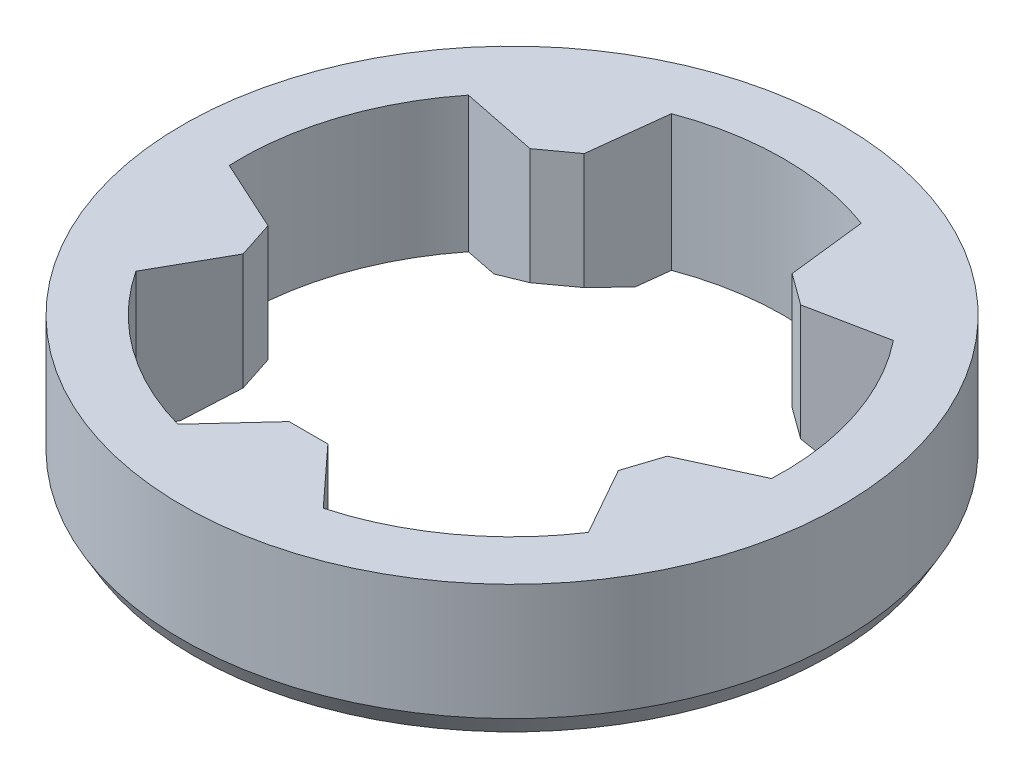
ISO-10303-21;
HEADER;
FILE_DESCRIPTION(('STEP AP214'),'2;1');
FILE_NAME('part.step','',(''),(''),'','','');
FILE_SCHEMA(('AUTOMOTIVE_DESIGN { 1 0 10303 214 1 1 1 1 }'));
ENDSEC;
DATA;
#1=APPLICATION_CONTEXT('core data for automotive mechanical design processes');
#2=APPLICATION_PROTOCOL_DEFINITION('international standard','automotive_design',2000,#1);
#3=PRODUCT_CONTEXT('',#1,'mechanical');
#4=PRODUCT('Part','Part','',(#3));
#5=PRODUCT_RELATED_PRODUCT_CATEGORY('part','',(#4));
#6=PRODUCT_DEFINITION_FORMATION('','',#4);
#7=PRODUCT_DEFINITION_CONTEXT('part definition',#1,'design');
#8=PRODUCT_DEFINITION('design','',#6,#7);
#9=PRODUCT_DEFINITION_SHAPE('','',#8);
#10=(LENGTH_UNIT() NAMED_UNIT(*) SI_UNIT(.MILLI.,.METRE.));
#11=(NAMED_UNIT(*) PLANE_ANGLE_UNIT() SI_UNIT($,.RADIAN.));
#12=(NAMED_UNIT(*) SI_UNIT($,.STERADIAN.) SOLID_ANGLE_UNIT());
#13=UNCERTAINTY_MEASURE_WITH_UNIT(LENGTH_MEASURE(1.E-05),#10,'distance_accuracy_value','');
#14=(GEOMETRIC_REPRESENTATION_CONTEXT(3) GLOBAL_UNCERTAINTY_ASSIGNED_CONTEXT((#13)) GLOBAL_UNIT_ASSIGNED_CONTEXT((#10,
#11,#12)) REPRESENTATION_CONTEXT('',''));
#15=CARTESIAN_POINT('',(0.,0.,0.));
#16=DIRECTION('',(0.,0.,1.));
#17=DIRECTION('',(1.,0.,0.));
#18=AXIS2_PLACEMENT_3D('',#15,#16,#17);
#19=CARTESIAN_POINT('',(22.3156312445708,-61.3015149587838,624.040224750278));
#20=DIRECTION('',(0.,-1.,0.));
#21=DIRECTION('',(0.,0.,-1.));
#22=AXIS2_PLACEMENT_3D('',#19,#20,#21);
#23=PLANE('',#22);
#24=CARTESIAN_POINT('',(22.3156312445708,-61.3015149587838,624.040224750278));
#25=DIRECTION('',(0.,-1.,0.));
#26=DIRECTION('',(0.,0.,-1.));
#27=AXIS2_PLACEMENT_3D('',#24,#25,#26);
#28=CIRCLE('',#27,32.8452994616208);
#29=CARTESIAN_POINT('',(22.3156312445708,-61.3015149587838,591.194925288657));
#30=VERTEX_POINT('',#29);
#31=EDGE_CURVE('E43',#30,#30,#28,.T.);
#32=ORIENTED_EDGE('',*,*,#31,.T.);
#33=EDGE_LOOP('',(#32));
#34=FACE_BOUND('',#33,.T.);
#35=DIRECTION('',(0.115298335752493,0.,-0.993330908495606));
#36=VECTOR('',#35,1.);
#37=CARTESIAN_POINT('',(11.5901749351788,-61.3015149587838,605.875297363819));
#38=LINE('',#37,#36);
#39=CARTESIAN_POINT('',(12.13857972971,-61.3015149587838,601.15062003678));
#40=VERTEX_POINT('',#39);
#41=CARTESIAN_POINT('',(12.5266688681274,-61.3015149587838,597.807111789888));
#42=VERTEX_POINT('',#41);
#43=EDGE_CURVE('E240',#40,#42,#38,.T.);
#44=ORIENTED_EDGE('',*,*,#43,.F.);
#45=DIRECTION('',(-0.80901699437495,0.,0.58778525229247));
#46=VECTOR('',#45,1.);
#47=CARTESIAN_POINT('',(7.9148925634052,-61.3015149587838,604.219308388091));
#48=LINE('',#47,#46);
#49=CARTESIAN_POINT('',(3.69120539710037,-61.3015149587838,607.287996739402));
#50=VERTEX_POINT('',#49);
#51=EDGE_CURVE('E368',#40,#50,#48,.T.);
#52=ORIENTED_EDGE('',*,*,#51,.T.);
#53=DIRECTION('',(0.980342978532801,0.,0.197300898227648));
#54=VECTOR('',#53,1.);
#55=CARTESIAN_POINT('',(8.35410695767896,-61.3015149587838,608.226438372988));
#56=LINE('',#55,#54);
#57=CARTESIAN_POINT('',(0.391413952503229,-61.3015149587838,606.623890574275));
#58=VERTEX_POINT('',#57);
#59=EDGE_CURVE('E237',#58,#50,#56,.T.);
#60=ORIENTED_EDGE('',*,*,#59,.F.);
#61=CARTESIAN_POINT('',(22.3156312445708,-61.3015149587838,624.040224750278));
#62=DIRECTION('',(0.,-1.,0.));
#63=DIRECTION('',(0.,0.,-1.));
#64=AXIS2_PLACEMENT_3D('',#61,#62,#63);
#65=CIRCLE('',#64,28.);
#66=CARTESIAN_POINT('',(-5.65849751073277,-61.3015149587838,625.243603486044));
#67=VERTEX_POINT('',#66);
#68=EDGE_CURVE('E235',#67,#58,#65,.T.);
#69=ORIENTED_EDGE('',*,*,#68,.F.);
#70=DIRECTION('',(-0.90908468819146,0.,-0.416611365298447));
#71=VECTOR('',#70,1.);
#72=CARTESIAN_POINT('',(1.72541041362262,-61.3015149587838,628.627468599561));
#73=LINE('',#72,#71);
#74=CARTESIAN_POINT('',(-2.59855834434228,-61.3015149587838,626.645899059162));
#75=VERTEX_POINT('',#74);
#76=EDGE_CURVE('E230',#75,#67,#73,.T.);
#77=ORIENTED_EDGE('',*,*,#76,.F.);
#78=DIRECTION('',(0.30901699437494,0.,0.951056516295156));
#79=VECTOR('',#78,1.);
#80=CARTESIAN_POINT('',(-0.985253404660671,-61.3015149587838,631.611141112464));
#81=LINE('',#80,#79);
#82=CARTESIAN_POINT('',(0.628051535021095,-61.3015149587838,636.576383165766));
#83=VERTEX_POINT('',#82);
#84=EDGE_CURVE('E360',#75,#83,#81,.T.);
#85=ORIENTED_EDGE('',*,*,#84,.T.);
#86=DIRECTION('',(0.49058694561308,0.,-0.871392247380036));
#87=VECTOR('',#86,1.);
#88=CARTESIAN_POINT('',(2.96147839112237,-61.3015149587838,632.431694664742));
#89=LINE('',#88,#87);
#90=CARTESIAN_POINT('',(-1.02324259510854,-61.3015149587838,639.509451230471));
#91=VERTEX_POINT('',#90);
#92=EDGE_CURVE('E228',#91,#83,#89,.T.);
#93=ORIENTED_EDGE('',*,*,#92,.F.);
#94=CARTESIAN_POINT('',(22.3156312445708,-61.3015149587838,624.040224750278));
#95=DIRECTION('',(0.,-1.,0.));
#96=DIRECTION('',(0.,0.,-1.));
#97=AXIS2_PLACEMENT_3D('',#94,#95,#96);
#98=CIRCLE('',#97,28.);
#99=CARTESIAN_POINT('',(14.8156312445708,-61.3015149587838,651.01706667071));
#100=VERTEX_POINT('',#99);
#101=EDGE_CURVE('E214',#100,#91,#98,.T.);
#102=ORIENTED_EDGE('',*,*,#101,.F.);
#103=DIRECTION('',(-0.677143571706916,0.,0.73585092464167));
#104=VECTOR('',#103,1.);
#105=CARTESIAN_POINT('',(20.3156312445708,-61.3015149587838,645.040224750278));
#106=LINE('',#105,#104);
#107=CARTESIAN_POINT('',(17.0948667913247,-61.3015149587838,648.540224750278));
#108=VERTEX_POINT('',#107);
#109=EDGE_CURVE('E203',#108,#100,#106,.T.);
#110=ORIENTED_EDGE('',*,*,#109,.F.);
#111=DIRECTION('',(1.,0.,0.));
#112=VECTOR('',#111,1.);
#113=CARTESIAN_POINT('',(22.3156312445708,-61.3015149587838,648.540224750278));
#114=LINE('',#113,#112);
#115=CARTESIAN_POINT('',(27.5363956978169,-61.3015149587838,648.540224750278));
#116=VERTEX_POINT('',#115);
#117=EDGE_CURVE('E362',#108,#116,#114,.T.);
#118=ORIENTED_EDGE('',*,*,#117,.T.);
#119=DIRECTION('',(-0.677143571706916,0.,-0.73585092464167));
#120=VECTOR('',#119,1.);
#121=CARTESIAN_POINT('',(24.3156312445708,-61.3015149587838,645.040224750278));
#122=LINE('',#121,#120);
#123=CARTESIAN_POINT('',(29.8156312445708,-61.3015149587838,651.01706667071));
#124=VERTEX_POINT('',#123);
#125=EDGE_CURVE('E215',#124,#116,#122,.T.);
#126=ORIENTED_EDGE('',*,*,#125,.F.);
#127=CARTESIAN_POINT('',(22.3156312445708,-61.3015149587838,624.040224750278));
#128=DIRECTION('',(0.,-1.,0.));
#129=DIRECTION('',(0.,0.,-1.));
#130=AXIS2_PLACEMENT_3D('',#127,#128,#129);
#131=CIRCLE('',#130,28.);
#132=CARTESIAN_POINT('',(45.6545050842502,-61.3015149587838,639.509451230471));
#133=VERTEX_POINT('',#132);
#134=EDGE_CURVE('E256',#133,#124,#131,.T.);
#135=ORIENTED_EDGE('',*,*,#134,.F.);
#136=DIRECTION('',(0.49058694561308,0.,0.871392247380036));
#137=VECTOR('',#136,1.);
#138=CARTESIAN_POINT('',(41.6697840980194,-61.3015149587838,632.431694664742));
#139=LINE('',#138,#137);
#140=CARTESIAN_POINT('',(44.0032109541206,-61.3015149587838,636.576383165766));
#141=VERTEX_POINT('',#140);
#142=EDGE_CURVE('E254',#141,#133,#139,.T.);
#143=ORIENTED_EDGE('',*,*,#142,.F.);
#144=DIRECTION('',(0.309016994374932,0.,-0.951056516295159));
#145=VECTOR('',#144,1.);
#146=CARTESIAN_POINT('',(45.6165158938024,-61.3015149587838,631.611141112464));
#147=LINE('',#146,#145);
#148=CARTESIAN_POINT('',(47.2298208334839,-61.3015149587838,626.645899059162));
#149=VERTEX_POINT('',#148);
#150=EDGE_CURVE('E364',#141,#149,#147,.T.);
#151=ORIENTED_EDGE('',*,*,#150,.T.);
#152=DIRECTION('',(-0.909084688191465,0.,0.416611365298436));
#153=VECTOR('',#152,1.);
#154=CARTESIAN_POINT('',(42.9058520755191,-61.3015149587838,628.627468599561));
#155=LINE('',#154,#153);
#156=CARTESIAN_POINT('',(50.2897599998745,-61.3015149587838,625.243603486044));
#157=VERTEX_POINT('',#156);
#158=EDGE_CURVE('E251',#157,#149,#155,.T.);
#159=ORIENTED_EDGE('',*,*,#158,.F.);
#160=CARTESIAN_POINT('',(22.3156312445708,-61.3015149587838,624.040224750278));
#161=DIRECTION('',(0.,-1.,0.));
#162=DIRECTION('',(0.,0.,-1.));
#163=AXIS2_PLACEMENT_3D('',#160,#161,#162);
#164=CIRCLE('',#163,28.);
#165=CARTESIAN_POINT('',(44.2398485366384,-61.3015149587838,606.623890574275));
#166=VERTEX_POINT('',#165);
#167=EDGE_CURVE('E249',#166,#157,#164,.T.);
#168=ORIENTED_EDGE('',*,*,#167,.F.);
#169=DIRECTION('',(0.980342978532798,0.,-0.197300898227661));
#170=VECTOR('',#169,1.);
#171=CARTESIAN_POINT('',(36.2771555314626,-61.3015149587838,608.226438372989));
#172=LINE('',#171,#170);
#173=CARTESIAN_POINT('',(40.9400570920411,-61.3015149587838,607.287996739402));
#174=VERTEX_POINT('',#173);
#175=EDGE_CURVE('E247',#174,#166,#172,.T.);
#176=ORIENTED_EDGE('',*,*,#175,.F.);
#177=DIRECTION('',(-0.80901699437495,0.,-0.58778525229247));
#178=VECTOR('',#177,1.);
#179=CARTESIAN_POINT('',(36.7163699257363,-61.3015149587838,604.219308388091));
#180=LINE('',#179,#178);
#181=CARTESIAN_POINT('',(32.4926827594316,-61.3015149587838,601.150620036781));
#182=VERTEX_POINT('',#181);
#183=EDGE_CURVE('E366',#174,#182,#180,.T.);
#184=ORIENTED_EDGE('',*,*,#183,.T.);
#185=DIRECTION('',(0.115298335752492,0.,0.993330908495606));
#186=VECTOR('',#185,1.);
#187=CARTESIAN_POINT('',(33.0410875539628,-61.3015149587838,605.875297363819));
#188=LINE('',#187,#186);
#189=CARTESIAN_POINT('',(32.1045936210141,-61.3015149587838,597.807111789888));
#190=VERTEX_POINT('',#189);
#191=EDGE_CURVE('E244',#190,#182,#188,.T.);
#192=ORIENTED_EDGE('',*,*,#191,.F.);
#193=CARTESIAN_POINT('',(22.3156312445708,-61.3015149587838,624.040224750278));
#194=DIRECTION('',(0.,-1.,0.));
#195=DIRECTION('',(0.,0.,-1.));
#196=AXIS2_PLACEMENT_3D('',#193,#194,#195);
#197=CIRCLE('',#196,28.);
#198=EDGE_CURVE('E242',#42,#190,#197,.T.);
#199=ORIENTED_EDGE('',*,*,#198,.F.);
#200=EDGE_LOOP('',(#44,#52,#60,#69,#77,#85,#93,#102,#110,#118,#126,#135,#143,#151,#159,#168,
#176,#184,#192,#199));
#201=FACE_BOUND('',#200,.T.);
#202=ADVANCED_FACE('F35',(#34,#201),#23,.T.);
#203=CARTESIAN_POINT('',(22.3156312445708,-47.3015149587838,624.040224750278));
#204=DIRECTION('',(0.,-1.,0.));
#205=DIRECTION('',(0.,0.,-1.));
#206=AXIS2_PLACEMENT_3D('',#203,#204,#205);
#207=PLANE('',#206);
#208=CARTESIAN_POINT('',(22.3156312445708,-47.3015149587838,624.040224750278));
#209=DIRECTION('',(0.,-1.,0.));
#210=DIRECTION('',(0.,0.,-1.));
#211=AXIS2_PLACEMENT_3D('',#208,#209,#210);
#212=CIRCLE('',#211,34.);
#213=CARTESIAN_POINT('',(22.3156312445708,-47.3015149587838,590.040224750278));
#214=VERTEX_POINT('',#213);
#215=EDGE_CURVE('E352',#214,#214,#212,.T.);
#216=ORIENTED_EDGE('',*,*,#215,.F.);
#217=EDGE_LOOP('',(#216));
#218=FACE_BOUND('',#217,.T.);
#219=DIRECTION('',(-0.677143571706916,0.,-0.73585092464167));
#220=VECTOR('',#219,1.);
#221=CARTESIAN_POINT('',(24.3156312445708,-47.3015149587838,645.040224750278));
#222=LINE('',#221,#220);
#223=CARTESIAN_POINT('',(29.8156312445709,-47.3015149587838,651.01706667071));
#224=VERTEX_POINT('',#223);
#225=CARTESIAN_POINT('',(24.3156312445708,-47.3015149587838,645.040224750278));
#226=VERTEX_POINT('',#225);
#227=EDGE_CURVE('E259',#224,#226,#222,.T.);
#228=ORIENTED_EDGE('',*,*,#227,.T.);
#229=DIRECTION('',(-1.,0.,0.));
#230=VECTOR('',#229,1.);
#231=CARTESIAN_POINT('',(20.3156312445708,-47.3015149587838,645.040224750278));
#232=LINE('',#231,#230);
#233=CARTESIAN_POINT('',(20.3156312445708,-47.3015149587838,645.040224750278));
#234=VERTEX_POINT('',#233);
#235=EDGE_CURVE('E262',#226,#234,#232,.T.);
#236=ORIENTED_EDGE('',*,*,#235,.T.);
#237=DIRECTION('',(-0.677143571706916,0.,0.73585092464167));
#238=VECTOR('',#237,1.);
#239=CARTESIAN_POINT('',(20.3156312445708,-47.3015149587838,645.040224750278));
#240=LINE('',#239,#238);
#241=CARTESIAN_POINT('',(14.8156312445708,-47.3015149587838,651.01706667071));
#242=VERTEX_POINT('',#241);
#243=EDGE_CURVE('E265',#234,#242,#240,.T.);
#244=ORIENTED_EDGE('',*,*,#243,.T.);
#245=CARTESIAN_POINT('',(22.3156312445708,-47.3015149587838,624.040224750278));
#246=DIRECTION('',(0.,-1.,0.));
#247=DIRECTION('',(0.,0.,-1.));
#248=AXIS2_PLACEMENT_3D('',#245,#246,#247);
#249=CIRCLE('',#248,28.);
#250=CARTESIAN_POINT('',(-1.02324259510854,-47.3015149587838,639.509451230471));
#251=VERTEX_POINT('',#250);
#252=EDGE_CURVE('E221',#242,#251,#249,.T.);
#253=ORIENTED_EDGE('',*,*,#252,.T.);
#254=DIRECTION('',(0.49058694561308,0.,-0.871392247380036));
#255=VECTOR('',#254,1.);
#256=CARTESIAN_POINT('',(2.96147839112237,-47.3015149587838,632.431694664742));
#257=LINE('',#256,#255);
#258=CARTESIAN_POINT('',(2.96147839112237,-47.3015149587838,632.431694664742));
#259=VERTEX_POINT('',#258);
#260=EDGE_CURVE('E268',#251,#259,#257,.T.);
#261=ORIENTED_EDGE('',*,*,#260,.T.);
#262=DIRECTION('',(-0.30901699437494,0.,-0.951056516295156));
#263=VECTOR('',#262,1.);
#264=CARTESIAN_POINT('',(1.72541041362262,-47.3015149587838,628.627468599561));
#265=LINE('',#264,#263);
#266=CARTESIAN_POINT('',(1.72541041362262,-47.3015149587838,628.627468599561));
#267=VERTEX_POINT('',#266);
#268=EDGE_CURVE('E271',#259,#267,#265,.T.);
#269=ORIENTED_EDGE('',*,*,#268,.T.);
#270=DIRECTION('',(-0.90908468819146,0.,-0.416611365298447));
#271=VECTOR('',#270,1.);
#272=CARTESIAN_POINT('',(1.72541041362262,-47.3015149587838,628.627468599561));
#273=LINE('',#272,#271);
#274=CARTESIAN_POINT('',(-5.65849751073277,-47.3015149587838,625.243603486044));
#275=VERTEX_POINT('',#274);
#276=EDGE_CURVE('E274',#267,#275,#273,.T.);
#277=ORIENTED_EDGE('',*,*,#276,.T.);
#278=CARTESIAN_POINT('',(22.3156312445708,-47.3015149587838,624.040224750278));
#279=DIRECTION('',(0.,-1.,0.));
#280=DIRECTION('',(0.,0.,-1.));
#281=AXIS2_PLACEMENT_3D('',#278,#279,#280);
#282=CIRCLE('',#281,28.);
#283=CARTESIAN_POINT('',(0.391413952503229,-47.3015149587838,606.623890574275));
#284=VERTEX_POINT('',#283);
#285=EDGE_CURVE('E277',#275,#284,#282,.T.);
#286=ORIENTED_EDGE('',*,*,#285,.T.);
#287=DIRECTION('',(0.980342978532801,0.,0.197300898227648));
#288=VECTOR('',#287,1.);
#289=CARTESIAN_POINT('',(8.35410695767896,-47.3015149587838,608.226438372988));
#290=LINE('',#289,#288);
#291=CARTESIAN_POINT('',(8.35410695767896,-47.3015149587838,608.226438372988));
#292=VERTEX_POINT('',#291);
#293=EDGE_CURVE('E280',#284,#292,#290,.T.);
#294=ORIENTED_EDGE('',*,*,#293,.T.);
#295=DIRECTION('',(0.80901699437495,0.,-0.58778525229247));
#296=VECTOR('',#295,1.);
#297=CARTESIAN_POINT('',(11.5901749351788,-47.3015149587838,605.875297363819));
#298=LINE('',#297,#296);
#299=CARTESIAN_POINT('',(11.5901749351788,-47.3015149587838,605.875297363819));
#300=VERTEX_POINT('',#299);
#301=EDGE_CURVE('E283',#292,#300,#298,.T.);
#302=ORIENTED_EDGE('',*,*,#301,.T.);
#303=DIRECTION('',(0.115298335752493,0.,-0.993330908495606));
#304=VECTOR('',#303,1.);
#305=CARTESIAN_POINT('',(11.5901749351788,-47.3015149587838,605.875297363819));
#306=LINE('',#305,#304);
#307=CARTESIAN_POINT('',(12.5266688681274,-47.3015149587838,597.807111789888));
#308=VERTEX_POINT('',#307);
#309=EDGE_CURVE('E286',#300,#308,#306,.T.);
#310=ORIENTED_EDGE('',*,*,#309,.T.);
#311=CARTESIAN_POINT('',(22.3156312445708,-47.3015149587838,624.040224750278));
#312=DIRECTION('',(0.,-1.,0.));
#313=DIRECTION('',(0.,0.,-1.));
#314=AXIS2_PLACEMENT_3D('',#311,#312,#313);
#315=CIRCLE('',#314,28.);
#316=CARTESIAN_POINT('',(32.1045936210141,-47.3015149587838,597.807111789888));
#317=VERTEX_POINT('',#316);
#318=EDGE_CURVE('E289',#308,#317,#315,.T.);
#319=ORIENTED_EDGE('',*,*,#318,.T.);
#320=DIRECTION('',(0.115298335752492,0.,0.993330908495606));
#321=VECTOR('',#320,1.);
#322=CARTESIAN_POINT('',(33.0410875539628,-47.3015149587838,605.875297363819));
#323=LINE('',#322,#321);
#324=CARTESIAN_POINT('',(33.0410875539628,-47.3015149587838,605.875297363819));
#325=VERTEX_POINT('',#324);
#326=EDGE_CURVE('E292',#317,#325,#323,.T.);
#327=ORIENTED_EDGE('',*,*,#326,.T.);
#328=DIRECTION('',(0.80901699437495,0.,0.58778525229247));
#329=VECTOR('',#328,1.);
#330=CARTESIAN_POINT('',(36.2771555314626,-47.3015149587838,608.226438372989));
#331=LINE('',#330,#329);
#332=CARTESIAN_POINT('',(36.2771555314626,-47.3015149587838,608.226438372989));
#333=VERTEX_POINT('',#332);
#334=EDGE_CURVE('E295',#325,#333,#331,.T.);
#335=ORIENTED_EDGE('',*,*,#334,.T.);
#336=DIRECTION('',(0.980342978532798,0.,-0.197300898227661));
#337=VECTOR('',#336,1.);
#338=CARTESIAN_POINT('',(36.2771555314626,-47.3015149587838,608.226438372989));
#339=LINE('',#338,#337);
#340=CARTESIAN_POINT('',(44.2398485366384,-47.3015149587838,606.623890574275));
#341=VERTEX_POINT('',#340);
#342=EDGE_CURVE('E298',#333,#341,#339,.T.);
#343=ORIENTED_EDGE('',*,*,#342,.T.);
#344=CARTESIAN_POINT('',(22.3156312445708,-47.3015149587838,624.040224750278));
#345=DIRECTION('',(0.,-1.,0.));
#346=DIRECTION('',(0.,0.,-1.));
#347=AXIS2_PLACEMENT_3D('',#344,#345,#346);
#348=CIRCLE('',#347,28.);
#349=CARTESIAN_POINT('',(50.2897599998745,-47.3015149587838,625.243603486044));
#350=VERTEX_POINT('',#349);
#351=EDGE_CURVE('E301',#341,#350,#348,.T.);
#352=ORIENTED_EDGE('',*,*,#351,.T.);
#353=DIRECTION('',(-0.909084688191465,0.,0.416611365298436));
#354=VECTOR('',#353,1.);
#355=CARTESIAN_POINT('',(42.9058520755191,-47.3015149587838,628.627468599561));
#356=LINE('',#355,#354);
#357=CARTESIAN_POINT('',(42.9058520755191,-47.3015149587838,628.627468599561));
#358=VERTEX_POINT('',#357);
#359=EDGE_CURVE('E304',#350,#358,#356,.T.);
#360=ORIENTED_EDGE('',*,*,#359,.T.);
#361=DIRECTION('',(-0.309016994374932,0.,0.951056516295159));
#362=VECTOR('',#361,1.);
#363=CARTESIAN_POINT('',(41.6697840980194,-47.3015149587838,632.431694664742));
#364=LINE('',#363,#362);
#365=CARTESIAN_POINT('',(41.6697840980194,-47.3015149587838,632.431694664742));
#366=VERTEX_POINT('',#365);
#367=EDGE_CURVE('E307',#358,#366,#364,.T.);
#368=ORIENTED_EDGE('',*,*,#367,.T.);
#369=DIRECTION('',(0.49058694561308,0.,0.871392247380036));
#370=VECTOR('',#369,1.);
#371=CARTESIAN_POINT('',(41.6697840980194,-47.3015149587838,632.431694664742));
#372=LINE('',#371,#370);
#373=CARTESIAN_POINT('',(45.6545050842503,-47.3015149587838,639.509451230471));
#374=VERTEX_POINT('',#373);
#375=EDGE_CURVE('E310',#366,#374,#372,.T.);
#376=ORIENTED_EDGE('',*,*,#375,.T.);
#377=CARTESIAN_POINT('',(22.3156312445708,-47.3015149587838,624.040224750278));
#378=DIRECTION('',(0.,-1.,0.));
#379=DIRECTION('',(0.,0.,-1.));
#380=AXIS2_PLACEMENT_3D('',#377,#378,#379);
#381=CIRCLE('',#380,28.);
#382=EDGE_CURVE('E313',#374,#224,#381,.T.);
#383=ORIENTED_EDGE('',*,*,#382,.T.);
#384=EDGE_LOOP('',(#228,#236,#244,#253,#261,#269,#277,#286,#294,#302,#310,#319,#327,#335,#343,
#352,#360,#368,#376,#383));
#385=FACE_BOUND('',#384,.T.);
#386=ADVANCED_FACE('F408',(#218,#385),#207,.F.);
#387=CARTESIAN_POINT('',(22.3156312445708,-61.3015149587838,624.040224750278));
#388=DIRECTION('',(0.,1.,0.));
#389=DIRECTION('',(0.,0.,1.));
#390=AXIS2_PLACEMENT_3D('',#387,#388,#389);
#391=CYLINDRICAL_SURFACE('',#390,34.);
#392=CARTESIAN_POINT('',(22.3156312445708,-59.3015149587838,624.040224750278));
#393=DIRECTION('',(0.,-1.,0.));
#394=DIRECTION('',(0.,0.,-1.));
#395=AXIS2_PLACEMENT_3D('',#392,#393,#394);
#396=CIRCLE('',#395,34.);
#397=CARTESIAN_POINT('',(22.3156312445708,-59.3015149587838,590.040224750278));
#398=VERTEX_POINT('',#397);
#399=EDGE_CURVE('E11',#398,#398,#396,.F.);
#400=ORIENTED_EDGE('',*,*,#399,.T.);
#401=EDGE_LOOP('',(#400));
#402=FACE_BOUND('',#401,.T.);
#403=ORIENTED_EDGE('',*,*,#215,.T.);
#404=EDGE_LOOP('',(#403));
#405=FACE_BOUND('',#404,.T.);
#406=ADVANCED_FACE('F413',(#402,#405),#391,.T.);
#407=CARTESIAN_POINT('',(24.3156312445708,-61.3015149587838,645.040224750278));
#408=DIRECTION('',(0.73585092464167,0.,-0.677143571706916));
#409=DIRECTION('',(-0.677143571706916,0.,-0.73585092464167));
#410=AXIS2_PLACEMENT_3D('',#407,#408,#409);
#411=PLANE('',#410);
#412=ORIENTED_EDGE('',*,*,#125,.T.);
#413=DIRECTION('',(0.62323121912748,-0.391018812688363,0.677264450291507));
#414=VECTOR('',#413,1.);
#415=CARTESIAN_POINT('',(24.8080723184355,-59.589749348054,645.575359741844));
#416=LINE('',#415,#414);
#417=CARTESIAN_POINT('',(24.3156312445708,-59.2807890166201,645.040224750278));
#418=VERTEX_POINT('',#417);
#419=EDGE_CURVE('E390',#116,#418,#416,.F.);
#420=ORIENTED_EDGE('',*,*,#419,.T.);
#421=DIRECTION('',(0.,1.,0.));
#422=VECTOR('',#421,1.);
#423=CARTESIAN_POINT('',(24.3156312445708,-61.3015149587838,645.040224750278));
#424=LINE('',#423,#422);
#425=EDGE_CURVE('E350',#418,#226,#424,.T.);
#426=ORIENTED_EDGE('',*,*,#425,.T.);
#427=ORIENTED_EDGE('',*,*,#227,.F.);
#428=DIRECTION('',(0.,1.,0.));
#429=VECTOR('',#428,1.);
#430=CARTESIAN_POINT('',(29.8156312445708,-61.3015149587838,651.01706667071));
#431=LINE('',#430,#429);
#432=EDGE_CURVE('E258',#124,#224,#431,.T.);
#433=ORIENTED_EDGE('',*,*,#432,.F.);
#434=EDGE_LOOP('',(#412,#420,#426,#427,#433));
#435=FACE_BOUND('',#434,.T.);
#436=ADVANCED_FACE('F417',(#435),#411,.T.);
#437=CARTESIAN_POINT('',(20.3156312445708,-61.3015149587838,645.040224750278));
#438=DIRECTION('',(0.,0.,-1.));
#439=DIRECTION('',(-1.,0.,0.));
#440=AXIS2_PLACEMENT_3D('',#437,#438,#439);
#441=PLANE('',#440);
#442=ORIENTED_EDGE('',*,*,#425,.F.);
#443=DIRECTION('',(-1.,0.,0.));
#444=VECTOR('',#443,1.);
#445=CARTESIAN_POINT('',(20.3156312445708,-59.2807890166201,645.040224750278));
#446=LINE('',#445,#444);
#447=CARTESIAN_POINT('',(20.3156312445708,-59.2807890166201,645.040224750278));
#448=VERTEX_POINT('',#447);
#449=EDGE_CURVE('E386',#418,#448,#446,.T.);
#450=ORIENTED_EDGE('',*,*,#449,.T.);
#451=DIRECTION('',(0.,1.,0.));
#452=VECTOR('',#451,1.);
#453=CARTESIAN_POINT('',(20.3156312445708,-61.3015149587838,645.040224750278));
#454=LINE('',#453,#452);
#455=EDGE_CURVE('E223',#448,#234,#454,.T.);
#456=ORIENTED_EDGE('',*,*,#455,.T.);
#457=ORIENTED_EDGE('',*,*,#235,.F.);
#458=EDGE_LOOP('',(#442,#450,#456,#457));
#459=FACE_BOUND('',#458,.T.);
#460=ADVANCED_FACE('F449',(#459),#441,.T.);
#461=CARTESIAN_POINT('',(20.3156312445708,-61.3015149587838,645.040224750278));
#462=DIRECTION('',(-0.73585092464167,0.,-0.677143571706916));
#463=DIRECTION('',(-0.677143571706916,0.,0.73585092464167));
#464=AXIS2_PLACEMENT_3D('',#461,#462,#463);
#465=PLANE('',#464);
#466=ORIENTED_EDGE('',*,*,#455,.F.);
#467=DIRECTION('',(0.62323121912748,0.391018812688363,-0.677264450291507));
#468=VECTOR('',#467,1.);
#469=CARTESIAN_POINT('',(19.8231901707061,-59.589749348054,645.575359741844));
#470=LINE('',#469,#468);
#471=EDGE_CURVE('E210',#448,#108,#470,.F.);
#472=ORIENTED_EDGE('',*,*,#471,.T.);
#473=ORIENTED_EDGE('',*,*,#109,.T.);
#474=DIRECTION('',(0.,1.,0.));
#475=VECTOR('',#474,1.);
#476=CARTESIAN_POINT('',(14.8156312445708,-61.3015149587838,651.01706667071));
#477=LINE('',#476,#475);
#478=EDGE_CURVE('E208',#100,#242,#477,.T.);
#479=ORIENTED_EDGE('',*,*,#478,.T.);
#480=ORIENTED_EDGE('',*,*,#243,.F.);
#481=EDGE_LOOP('',(#466,#472,#473,#479,#480));
#482=FACE_BOUND('',#481,.T.);
#483=ADVANCED_FACE('F206',(#482),#465,.T.);
#484=CARTESIAN_POINT('',(22.3156312445708,-61.3015149587838,624.040224750278));
#485=DIRECTION('',(0.,1.,0.));
#486=DIRECTION('',(0.,0.,1.));
#487=AXIS2_PLACEMENT_3D('',#484,#485,#486);
#488=CYLINDRICAL_SURFACE('',#487,28.);
#489=ORIENTED_EDGE('',*,*,#252,.F.);
#490=ORIENTED_EDGE('',*,*,#478,.F.);
#491=ORIENTED_EDGE('',*,*,#101,.T.);
#492=DIRECTION('',(0.,1.,0.));
#493=VECTOR('',#492,1.);
#494=CARTESIAN_POINT('',(-1.02324259510854,-61.3015149587838,639.509451230471));
#495=LINE('',#494,#493);
#496=EDGE_CURVE('E224',#91,#251,#495,.T.);
#497=ORIENTED_EDGE('',*,*,#496,.T.);
#498=EDGE_LOOP('',(#489,#490,#491,#497));
#499=FACE_BOUND('',#498,.T.);
#500=ADVANCED_FACE('F218',(#499),#488,.F.);
#501=CARTESIAN_POINT('',(2.96147839112237,-61.3015149587838,632.431694664742));
#502=DIRECTION('',(0.871392247380036,0.,0.49058694561308));
#503=DIRECTION('',(0.49058694561308,0.,-0.871392247380036));
#504=AXIS2_PLACEMENT_3D('',#501,#502,#503);
#505=PLANE('',#504);
#506=ORIENTED_EDGE('',*,*,#92,.T.);
#507=DIRECTION('',(-0.451527730569379,-0.391018812688358,0.802014336935851));
#508=VECTOR('',#507,1.);
#509=CARTESIAN_POINT('',(2.60470743084769,-59.5897493480539,633.065399763611));
#510=LINE('',#509,#508);
#511=CARTESIAN_POINT('',(2.96147839112237,-59.2807890166201,632.431694664742));
#512=VERTEX_POINT('',#511);
#513=EDGE_CURVE('E58',#83,#512,#510,.F.);
#514=ORIENTED_EDGE('',*,*,#513,.T.);
#515=DIRECTION('',(0.,1.,0.));
#516=VECTOR('',#515,1.);
#517=CARTESIAN_POINT('',(2.96147839112237,-61.3015149587838,632.431694664742));
#518=LINE('',#517,#516);
#519=EDGE_CURVE('E346',#512,#259,#518,.T.);
#520=ORIENTED_EDGE('',*,*,#519,.T.);
#521=ORIENTED_EDGE('',*,*,#260,.F.);
#522=ORIENTED_EDGE('',*,*,#496,.F.);
#523=EDGE_LOOP('',(#506,#514,#520,#521,#522));
#524=FACE_BOUND('',#523,.T.);
#525=ADVANCED_FACE('F527',(#524),#505,.T.);
#526=CARTESIAN_POINT('',(1.72541041362262,-61.3015149587838,628.627468599561));
#527=DIRECTION('',(0.951056516295156,0.,-0.30901699437494));
#528=DIRECTION('',(-0.30901699437494,0.,-0.951056516295156));
#529=AXIS2_PLACEMENT_3D('',#526,#527,#528);
#530=PLANE('',#529);
#531=ORIENTED_EDGE('',*,*,#519,.F.);
#532=DIRECTION('',(-0.30901699437494,0.,-0.951056516295156));
#533=VECTOR('',#532,1.);
#534=CARTESIAN_POINT('',(1.72541041362262,-59.2807890166201,628.627468599561));
#535=LINE('',#534,#533);
#536=CARTESIAN_POINT('',(1.72541041362262,-59.2807890166201,628.627468599561));
#537=VERTEX_POINT('',#536);
#538=EDGE_CURVE('E392',#512,#537,#535,.T.);
#539=ORIENTED_EDGE('',*,*,#538,.T.);
#540=DIRECTION('',(0.,1.,0.));
#541=VECTOR('',#540,1.);
#542=CARTESIAN_POINT('',(1.72541041362262,-61.3015149587838,628.627468599561));
#543=LINE('',#542,#541);
#544=EDGE_CURVE('E344',#537,#267,#543,.T.);
#545=ORIENTED_EDGE('',*,*,#544,.T.);
#546=ORIENTED_EDGE('',*,*,#268,.F.);
#547=EDGE_LOOP('',(#531,#539,#545,#546));
#548=FACE_BOUND('',#547,.T.);
#549=ADVANCED_FACE('F526',(#548),#530,.T.);
#550=CARTESIAN_POINT('',(1.72541041362262,-61.3015149587838,628.627468599561));
#551=DIRECTION('',(0.416611365298447,0.,-0.90908468819146));
#552=DIRECTION('',(-0.90908468819146,0.,-0.416611365298447));
#553=AXIS2_PLACEMENT_3D('',#550,#551,#552);
#554=PLANE('',#553);
#555=ORIENTED_EDGE('',*,*,#544,.F.);
#556=DIRECTION('',(0.836705806840199,0.391018812688363,0.383441887283686));
#557=VECTOR('',#556,1.);
#558=CARTESIAN_POINT('',(1.06429413224305,-59.5897493480539,628.32449511405));
#559=LINE('',#558,#557);
#560=EDGE_CURVE('E50',#537,#75,#559,.F.);
#561=ORIENTED_EDGE('',*,*,#560,.T.);
#562=ORIENTED_EDGE('',*,*,#76,.T.);
#563=DIRECTION('',(0.,1.,0.));
#564=VECTOR('',#563,1.);
#565=CARTESIAN_POINT('',(-5.65849751073277,-61.3015149587838,625.243603486044));
#566=LINE('',#565,#564);
#567=EDGE_CURVE('E342',#67,#275,#566,.T.);
#568=ORIENTED_EDGE('',*,*,#567,.T.);
#569=ORIENTED_EDGE('',*,*,#276,.F.);
#570=EDGE_LOOP('',(#555,#561,#562,#568,#569));
#571=FACE_BOUND('',#570,.T.);
#572=ADVANCED_FACE('F523',(#571),#554,.T.);
#573=CARTESIAN_POINT('',(22.3156312445708,-61.3015149587838,624.040224750278));
#574=DIRECTION('',(0.,1.,0.));
#575=DIRECTION('',(0.,0.,1.));
#576=AXIS2_PLACEMENT_3D('',#573,#574,#575);
#577=CYLINDRICAL_SURFACE('',#576,28.);
#578=ORIENTED_EDGE('',*,*,#285,.F.);
#579=ORIENTED_EDGE('',*,*,#567,.F.);
#580=ORIENTED_EDGE('',*,*,#68,.T.);
#581=DIRECTION('',(0.,1.,0.));
#582=VECTOR('',#581,1.);
#583=CARTESIAN_POINT('',(0.391413952503229,-61.3015149587838,606.623890574275));
#584=LINE('',#583,#582);
#585=EDGE_CURVE('E340',#58,#284,#584,.T.);
#586=ORIENTED_EDGE('',*,*,#585,.T.);
#587=EDGE_LOOP('',(#578,#579,#580,#586));
#588=FACE_BOUND('',#587,.T.);
#589=ADVANCED_FACE('F519',(#588),#577,.F.);
#590=CARTESIAN_POINT('',(8.35410695767896,-61.3015149587838,608.226438372988));
#591=DIRECTION('',(-0.197300898227648,0.,0.980342978532801));
#592=DIRECTION('',(0.980342978532801,0.,0.197300898227648));
#593=AXIS2_PLACEMENT_3D('',#590,#591,#592);
#594=PLANE('',#593);
#595=ORIENTED_EDGE('',*,*,#59,.T.);
#596=DIRECTION('',(-0.902290703482467,-0.391018812688361,-0.181592330600439));
#597=VECTOR('',#596,1.);
#598=CARTESIAN_POINT('',(7.64116930416558,-59.5897493480539,608.082954671367));
#599=LINE('',#598,#597);
#600=CARTESIAN_POINT('',(8.35410695767896,-59.2807890166201,608.226438372988));
#601=VERTEX_POINT('',#600);
#602=EDGE_CURVE('E370',#50,#601,#599,.F.);
#603=ORIENTED_EDGE('',*,*,#602,.T.);
#604=DIRECTION('',(0.,1.,0.));
#605=VECTOR('',#604,1.);
#606=CARTESIAN_POINT('',(8.35410695767896,-61.3015149587838,608.226438372988));
#607=LINE('',#606,#605);
#608=EDGE_CURVE('E338',#601,#292,#607,.T.);
#609=ORIENTED_EDGE('',*,*,#608,.T.);
#610=ORIENTED_EDGE('',*,*,#293,.F.);
#611=ORIENTED_EDGE('',*,*,#585,.F.);
#612=EDGE_LOOP('',(#595,#603,#609,#610,#611));
#613=FACE_BOUND('',#612,.T.);
#614=ADVANCED_FACE('F511',(#613),#594,.T.);
#615=CARTESIAN_POINT('',(11.5901749351788,-61.3015149587838,605.875297363819));
#616=DIRECTION('',(0.58778525229247,0.,0.80901699437495));
#617=DIRECTION('',(0.80901699437495,0.,-0.58778525229247));
#618=AXIS2_PLACEMENT_3D('',#615,#616,#617);
#619=PLANE('',#618);
#620=ORIENTED_EDGE('',*,*,#608,.F.);
#621=DIRECTION('',(0.80901699437495,0.,-0.58778525229247));
#622=VECTOR('',#621,1.);
#623=CARTESIAN_POINT('',(11.5901749351788,-59.2807890166201,605.875297363819));
#624=LINE('',#623,#622);
#625=CARTESIAN_POINT('',(11.5901749351788,-59.2807890166201,605.875297363819));
#626=VERTEX_POINT('',#625);
#627=EDGE_CURVE('E355',#601,#626,#624,.T.);
#628=ORIENTED_EDGE('',*,*,#627,.T.);
#629=DIRECTION('',(0.,1.,0.));
#630=VECTOR('',#629,1.);
#631=CARTESIAN_POINT('',(11.5901749351788,-61.3015149587838,605.875297363819));
#632=LINE('',#631,#630);
#633=EDGE_CURVE('E336',#626,#300,#632,.T.);
#634=ORIENTED_EDGE('',*,*,#633,.T.);
#635=ORIENTED_EDGE('',*,*,#301,.F.);
#636=EDGE_LOOP('',(#620,#628,#634,#635));
#637=FACE_BOUND('',#636,.T.);
#638=ADVANCED_FACE('F507',(#637),#619,.T.);
#639=CARTESIAN_POINT('',(11.5901749351788,-61.3015149587838,605.875297363819));
#640=DIRECTION('',(0.993330908495606,0.,0.115298335752493));
#641=DIRECTION('',(0.115298335752493,0.,-0.993330908495606));
#642=AXIS2_PLACEMENT_3D('',#639,#640,#641);
#643=PLANE('',#642);
#644=ORIENTED_EDGE('',*,*,#633,.F.);
#645=DIRECTION('',(-0.106118591915833,0.391018812688365,0.914244569343227));
#646=VECTOR('',#645,1.);
#647=CARTESIAN_POINT('',(11.674023676635,-59.5897493480539,605.152914460516));
#648=LINE('',#647,#646);
#649=EDGE_CURVE('E358',#626,#40,#648,.F.);
#650=ORIENTED_EDGE('',*,*,#649,.T.);
#651=ORIENTED_EDGE('',*,*,#43,.T.);
#652=DIRECTION('',(0.,1.,0.));
#653=VECTOR('',#652,1.);
#654=CARTESIAN_POINT('',(12.5266688681274,-61.3015149587838,597.807111789888));
#655=LINE('',#654,#653);
#656=EDGE_CURVE('E334',#42,#308,#655,.T.);
#657=ORIENTED_EDGE('',*,*,#656,.T.);
#658=ORIENTED_EDGE('',*,*,#309,.F.);
#659=EDGE_LOOP('',(#644,#650,#651,#657,#658));
#660=FACE_BOUND('',#659,.T.);
#661=ADVANCED_FACE('F502',(#660),#643,.T.);
#662=CARTESIAN_POINT('',(22.3156312445708,-61.3015149587838,624.040224750278));
#663=DIRECTION('',(0.,1.,0.));
#664=DIRECTION('',(0.,0.,1.));
#665=AXIS2_PLACEMENT_3D('',#662,#663,#664);
#666=CYLINDRICAL_SURFACE('',#665,28.);
#667=ORIENTED_EDGE('',*,*,#318,.F.);
#668=ORIENTED_EDGE('',*,*,#656,.F.);
#669=ORIENTED_EDGE('',*,*,#198,.T.);
#670=DIRECTION('',(0.,1.,0.));
#671=VECTOR('',#670,1.);
#672=CARTESIAN_POINT('',(32.1045936210141,-61.3015149587838,597.807111789888));
#673=LINE('',#672,#671);
#674=EDGE_CURVE('E332',#190,#317,#673,.T.);
#675=ORIENTED_EDGE('',*,*,#674,.T.);
#676=EDGE_LOOP('',(#667,#668,#669,#675));
#677=FACE_BOUND('',#676,.T.);
#678=ADVANCED_FACE('F498',(#677),#666,.F.);
#679=CARTESIAN_POINT('',(33.0410875539628,-61.3015149587838,605.875297363819));
#680=DIRECTION('',(-0.993330908495606,0.,0.115298335752492));
#681=DIRECTION('',(0.115298335752492,0.,0.993330908495606));
#682=AXIS2_PLACEMENT_3D('',#679,#680,#681);
#683=PLANE('',#682);
#684=ORIENTED_EDGE('',*,*,#191,.T.);
#685=DIRECTION('',(-0.106118591915831,-0.391018812688367,-0.914244569343226));
#686=VECTOR('',#685,1.);
#687=CARTESIAN_POINT('',(32.9572388125066,-59.5897493480539,605.152914460516));
#688=LINE('',#687,#686);
#689=CARTESIAN_POINT('',(33.0410875539628,-59.2807890166201,605.875297363819));
#690=VERTEX_POINT('',#689);
#691=EDGE_CURVE('E377',#182,#690,#688,.F.);
#692=ORIENTED_EDGE('',*,*,#691,.T.);
#693=DIRECTION('',(0.,1.,0.));
#694=VECTOR('',#693,1.);
#695=CARTESIAN_POINT('',(33.0410875539628,-61.3015149587838,605.875297363819));
#696=LINE('',#695,#694);
#697=EDGE_CURVE('E330',#690,#325,#696,.T.);
#698=ORIENTED_EDGE('',*,*,#697,.T.);
#699=ORIENTED_EDGE('',*,*,#326,.F.);
#700=ORIENTED_EDGE('',*,*,#674,.F.);
#701=EDGE_LOOP('',(#684,#692,#698,#699,#700));
#702=FACE_BOUND('',#701,.T.);
#703=ADVANCED_FACE('F490',(#702),#683,.T.);
#704=CARTESIAN_POINT('',(36.2771555314626,-61.3015149587838,608.226438372989));
#705=DIRECTION('',(-0.58778525229247,0.,0.80901699437495));
#706=DIRECTION('',(0.80901699437495,0.,0.58778525229247));
#707=AXIS2_PLACEMENT_3D('',#704,#705,#706);
#708=PLANE('',#707);
#709=ORIENTED_EDGE('',*,*,#697,.F.);
#710=DIRECTION('',(0.80901699437495,0.,0.58778525229247));
#711=VECTOR('',#710,1.);
#712=CARTESIAN_POINT('',(36.2771555314626,-59.2807890166201,608.226438372989));
#713=LINE('',#712,#711);
#714=CARTESIAN_POINT('',(36.2771555314626,-59.2807890166201,608.226438372989));
#715=VERTEX_POINT('',#714);
#716=EDGE_CURVE('E372',#690,#715,#713,.T.);
#717=ORIENTED_EDGE('',*,*,#716,.T.);
#718=DIRECTION('',(0.,1.,0.));
#719=VECTOR('',#718,1.);
#720=CARTESIAN_POINT('',(36.2771555314626,-61.3015149587838,608.226438372989));
#721=LINE('',#720,#719);
#722=EDGE_CURVE('E328',#715,#333,#721,.T.);
#723=ORIENTED_EDGE('',*,*,#722,.T.);
#724=ORIENTED_EDGE('',*,*,#334,.F.);
#725=EDGE_LOOP('',(#709,#717,#723,#724));
#726=FACE_BOUND('',#725,.T.);
#727=ADVANCED_FACE('F486',(#726),#708,.T.);
#728=CARTESIAN_POINT('',(36.2771555314626,-61.3015149587838,608.226438372989));
#729=DIRECTION('',(0.197300898227661,0.,0.980342978532798));
#730=DIRECTION('',(0.980342978532798,0.,-0.197300898227661));
#731=AXIS2_PLACEMENT_3D('',#728,#729,#730);
#732=PLANE('',#731);
#733=ORIENTED_EDGE('',*,*,#722,.F.);
#734=DIRECTION('',(-0.902290703482462,0.391018812688367,0.18159233060045));
#735=VECTOR('',#734,1.);
#736=CARTESIAN_POINT('',(36.990093184976,-59.5897493480539,608.082954671367));
#737=LINE('',#736,#735);
#738=EDGE_CURVE('E375',#715,#174,#737,.F.);
#739=ORIENTED_EDGE('',*,*,#738,.T.);
#740=ORIENTED_EDGE('',*,*,#175,.T.);
#741=DIRECTION('',(0.,1.,0.));
#742=VECTOR('',#741,1.);
#743=CARTESIAN_POINT('',(44.2398485366384,-61.3015149587838,606.623890574275));
#744=LINE('',#743,#742);
#745=EDGE_CURVE('E326',#166,#341,#744,.T.);
#746=ORIENTED_EDGE('',*,*,#745,.T.);
#747=ORIENTED_EDGE('',*,*,#342,.F.);
#748=EDGE_LOOP('',(#733,#739,#740,#746,#747));
#749=FACE_BOUND('',#748,.T.);
#750=ADVANCED_FACE('F481',(#749),#732,.T.);
#751=CARTESIAN_POINT('',(22.3156312445708,-61.3015149587838,624.040224750278));
#752=DIRECTION('',(0.,1.,0.));
#753=DIRECTION('',(0.,0.,1.));
#754=AXIS2_PLACEMENT_3D('',#751,#752,#753);
#755=CYLINDRICAL_SURFACE('',#754,28.);
#756=ORIENTED_EDGE('',*,*,#351,.F.);
#757=ORIENTED_EDGE('',*,*,#745,.F.);
#758=ORIENTED_EDGE('',*,*,#167,.T.);
#759=DIRECTION('',(0.,1.,0.));
#760=VECTOR('',#759,1.);
#761=CARTESIAN_POINT('',(50.2897599998745,-61.3015149587838,625.243603486044));
#762=LINE('',#761,#760);
#763=EDGE_CURVE('E324',#157,#350,#762,.T.);
#764=ORIENTED_EDGE('',*,*,#763,.T.);
#765=EDGE_LOOP('',(#756,#757,#758,#764));
#766=FACE_BOUND('',#765,.T.);
#767=ADVANCED_FACE('F477',(#766),#755,.F.);
#768=CARTESIAN_POINT('',(42.9058520755191,-61.3015149587838,628.627468599561));
#769=DIRECTION('',(-0.416611365298436,0.,-0.909084688191465));
#770=DIRECTION('',(-0.909084688191465,0.,0.416611365298436));
#771=AXIS2_PLACEMENT_3D('',#768,#769,#770);
#772=PLANE('',#771);
#773=ORIENTED_EDGE('',*,*,#158,.T.);
#774=DIRECTION('',(0.836705806840202,-0.391018812688367,-0.383441887283674));
#775=VECTOR('',#774,1.);
#776=CARTESIAN_POINT('',(43.5669683568987,-59.5897493480539,628.32449511405));
#777=LINE('',#776,#775);
#778=CARTESIAN_POINT('',(42.9058520755191,-59.2807890166201,628.627468599561));
#779=VERTEX_POINT('',#778);
#780=EDGE_CURVE('E384',#149,#779,#777,.F.);
#781=ORIENTED_EDGE('',*,*,#780,.T.);
#782=DIRECTION('',(0.,1.,0.));
#783=VECTOR('',#782,1.);
#784=CARTESIAN_POINT('',(42.9058520755191,-61.3015149587838,628.627468599561));
#785=LINE('',#784,#783);
#786=EDGE_CURVE('E322',#779,#358,#785,.T.);
#787=ORIENTED_EDGE('',*,*,#786,.T.);
#788=ORIENTED_EDGE('',*,*,#359,.F.);
#789=ORIENTED_EDGE('',*,*,#763,.F.);
#790=EDGE_LOOP('',(#773,#781,#787,#788,#789));
#791=FACE_BOUND('',#790,.T.);
#792=ADVANCED_FACE('F463',(#791),#772,.T.);
#793=CARTESIAN_POINT('',(41.6697840980194,-61.3015149587838,632.431694664742));
#794=DIRECTION('',(-0.951056516295159,0.,-0.309016994374932));
#795=DIRECTION('',(-0.309016994374932,0.,0.951056516295159));
#796=AXIS2_PLACEMENT_3D('',#793,#794,#795);
#797=PLANE('',#796);
#798=ORIENTED_EDGE('',*,*,#786,.F.);
#799=DIRECTION('',(-0.309016994374932,0.,0.951056516295159));
#800=VECTOR('',#799,1.);
#801=CARTESIAN_POINT('',(41.6697840980194,-59.2807890166201,632.431694664742));
#802=LINE('',#801,#800);
#803=CARTESIAN_POINT('',(41.6697840980194,-59.2807890166201,632.431694664742));
#804=VERTEX_POINT('',#803);
#805=EDGE_CURVE('E379',#779,#804,#802,.T.);
#806=ORIENTED_EDGE('',*,*,#805,.T.);
#807=DIRECTION('',(0.,1.,0.));
#808=VECTOR('',#807,1.);
#809=CARTESIAN_POINT('',(41.6697840980194,-61.3015149587838,632.431694664742));
#810=LINE('',#809,#808);
#811=EDGE_CURVE('E320',#804,#366,#810,.T.);
#812=ORIENTED_EDGE('',*,*,#811,.T.);
#813=ORIENTED_EDGE('',*,*,#367,.F.);
#814=EDGE_LOOP('',(#798,#806,#812,#813));
#815=FACE_BOUND('',#814,.T.);
#816=ADVANCED_FACE('F468',(#815),#797,.T.);
#817=CARTESIAN_POINT('',(41.6697840980194,-61.3015149587838,632.431694664742));
#818=DIRECTION('',(-0.871392247380036,0.,0.49058694561308));
#819=DIRECTION('',(0.49058694561308,0.,0.871392247380036));
#820=AXIS2_PLACEMENT_3D('',#817,#818,#819);
#821=PLANE('',#820);
#822=ORIENTED_EDGE('',*,*,#811,.F.);
#823=DIRECTION('',(-0.45152773056938,0.391018812688353,-0.802014336935853));
#824=VECTOR('',#823,1.);
#825=CARTESIAN_POINT('',(42.026555058294,-59.5897493480539,633.065399763611));
#826=LINE('',#825,#824);
#827=EDGE_CURVE('E382',#804,#141,#826,.F.);
#828=ORIENTED_EDGE('',*,*,#827,.T.);
#829=ORIENTED_EDGE('',*,*,#142,.T.);
#830=DIRECTION('',(0.,1.,0.));
#831=VECTOR('',#830,1.);
#832=CARTESIAN_POINT('',(45.6545050842503,-61.3015149587838,639.509451230471));
#833=LINE('',#832,#831);
#834=EDGE_CURVE('E318',#133,#374,#833,.T.);
#835=ORIENTED_EDGE('',*,*,#834,.T.);
#836=ORIENTED_EDGE('',*,*,#375,.F.);
#837=EDGE_LOOP('',(#822,#828,#829,#835,#836));
#838=FACE_BOUND('',#837,.T.);
#839=ADVANCED_FACE('F603',(#838),#821,.T.);
#840=CARTESIAN_POINT('',(22.3156312445708,-61.3015149587838,624.040224750278));
#841=DIRECTION('',(0.,1.,0.));
#842=DIRECTION('',(0.,0.,1.));
#843=AXIS2_PLACEMENT_3D('',#840,#841,#842);
#844=CYLINDRICAL_SURFACE('',#843,28.);
#845=ORIENTED_EDGE('',*,*,#382,.F.);
#846=ORIENTED_EDGE('',*,*,#834,.F.);
#847=ORIENTED_EDGE('',*,*,#134,.T.);
#848=ORIENTED_EDGE('',*,*,#432,.T.);
#849=EDGE_LOOP('',(#845,#846,#847,#848));
#850=FACE_BOUND('',#849,.T.);
#851=ADVANCED_FACE('F427',(#850),#844,.F.);
#852=CARTESIAN_POINT('',(11.5901749351788,-59.2807890166201,605.875297363819));
#853=DIRECTION('',(-0.293892626146235,0.866025403784439,-0.404508497187474));
#854=DIRECTION('',(0.80901699437495,0.,-0.58778525229247));
#855=AXIS2_PLACEMENT_3D('',#852,#853,#854);
#856=PLANE('',#855);
#857=ORIENTED_EDGE('',*,*,#602,.F.);
#858=ORIENTED_EDGE('',*,*,#51,.F.);
#859=ORIENTED_EDGE('',*,*,#649,.F.);
#860=ORIENTED_EDGE('',*,*,#627,.F.);
#861=EDGE_LOOP('',(#857,#858,#859,#860));
#862=FACE_BOUND('',#861,.T.);
#863=ADVANCED_FACE('F423',(#862),#856,.F.);
#864=CARTESIAN_POINT('',(36.2771555314626,-59.2807890166201,608.226438372989));
#865=DIRECTION('',(0.293892626146235,0.866025403784438,-0.404508497187476));
#866=DIRECTION('',(0.80901699437495,0.,0.58778525229247));
#867=AXIS2_PLACEMENT_3D('',#864,#865,#866);
#868=PLANE('',#867);
#869=ORIENTED_EDGE('',*,*,#691,.F.);
#870=ORIENTED_EDGE('',*,*,#183,.F.);
#871=ORIENTED_EDGE('',*,*,#738,.F.);
#872=ORIENTED_EDGE('',*,*,#716,.F.);
#873=EDGE_LOOP('',(#869,#870,#871,#872));
#874=FACE_BOUND('',#873,.T.);
#875=ADVANCED_FACE('F426',(#874),#868,.F.);
#876=CARTESIAN_POINT('',(41.6697840980194,-59.2807890166201,632.431694664742));
#877=DIRECTION('',(0.475528258147574,0.866025403784442,0.154508497187465));
#878=DIRECTION('',(-0.309016994374932,0.,0.951056516295159));
#879=AXIS2_PLACEMENT_3D('',#876,#877,#878);
#880=PLANE('',#879);
#881=ORIENTED_EDGE('',*,*,#780,.F.);
#882=ORIENTED_EDGE('',*,*,#150,.F.);
#883=ORIENTED_EDGE('',*,*,#827,.F.);
#884=ORIENTED_EDGE('',*,*,#805,.F.);
#885=EDGE_LOOP('',(#881,#882,#883,#884));
#886=FACE_BOUND('',#885,.T.);
#887=ADVANCED_FACE('F431',(#886),#880,.F.);
#888=CARTESIAN_POINT('',(20.3156312445708,-59.2807890166201,645.040224750278));
#889=DIRECTION('',(0.,0.86602540378444,0.499999999999998));
#890=DIRECTION('',(-1.,0.,0.));
#891=AXIS2_PLACEMENT_3D('',#888,#889,#890);
#892=PLANE('',#891);
#893=ORIENTED_EDGE('',*,*,#419,.F.);
#894=ORIENTED_EDGE('',*,*,#117,.F.);
#895=ORIENTED_EDGE('',*,*,#471,.F.);
#896=ORIENTED_EDGE('',*,*,#449,.F.);
#897=EDGE_LOOP('',(#893,#894,#895,#896));
#898=FACE_BOUND('',#897,.T.);
#899=ADVANCED_FACE('F405',(#898),#892,.F.);
#900=CARTESIAN_POINT('',(1.72541041362262,-59.2807890166201,628.627468599561));
#901=DIRECTION('',(-0.475528258147576,0.86602540378444,0.154508497187469));
#902=DIRECTION('',(-0.30901699437494,0.,-0.951056516295156));
#903=AXIS2_PLACEMENT_3D('',#900,#901,#902);
#904=PLANE('',#903);
#905=ORIENTED_EDGE('',*,*,#513,.F.);
#906=ORIENTED_EDGE('',*,*,#84,.F.);
#907=ORIENTED_EDGE('',*,*,#560,.F.);
#908=ORIENTED_EDGE('',*,*,#538,.F.);
#909=EDGE_LOOP('',(#905,#906,#907,#908));
#910=FACE_BOUND('',#909,.T.);
#911=ADVANCED_FACE('F400',(#910),#904,.F.);
#912=CARTESIAN_POINT('',(22.3156312445708,-61.3015149587838,624.040224750278));
#913=DIRECTION('',(0.,1.,0.));
#914=DIRECTION('',(0.,0.,1.));
#915=AXIS2_PLACEMENT_3D('',#912,#913,#914);
#916=CONICAL_SURFACE('',#915,32.8452994616208,0.523598775598276);
#917=ORIENTED_EDGE('',*,*,#399,.F.);
#918=EDGE_LOOP('',(#917));
#919=FACE_BOUND('',#918,.T.);
#920=ORIENTED_EDGE('',*,*,#31,.F.);
#921=EDGE_LOOP('',(#920));
#922=FACE_BOUND('',#921,.T.);
#923=ADVANCED_FACE('F37',(#919,#922),#916,.T.);
#924=CLOSED_SHELL('',(#202,#386,#406,#436,#460,#483,#500,#525,#549,#572,#589,#614,#638,#661,
#678,#703,#727,#750,#767,#792,#816,#839,#851,#863,#875,#887,#899,#911,#923));
#925=MANIFOLD_SOLID_BREP('B2',#924);
#926=ADVANCED_BREP_SHAPE_REPRESENTATION('',(#18,#925),#14);
#927=SHAPE_DEFINITION_REPRESENTATION(#9,#926);
ENDSEC;
END-ISO-10303-21;
